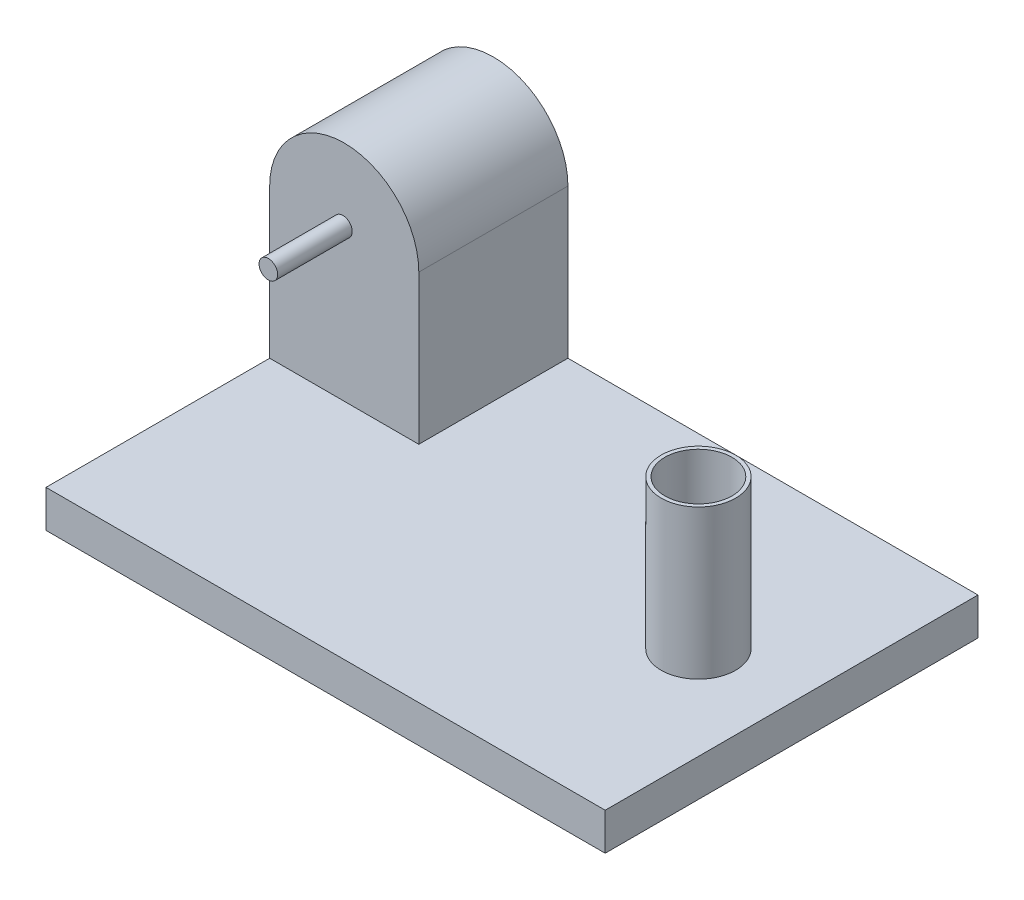
ISO-10303-21;
HEADER;
FILE_DESCRIPTION(('STEP AP214'),'2;1');
FILE_NAME('part.step','',(''),(''),'','','');
FILE_SCHEMA(('AUTOMOTIVE_DESIGN { 1 0 10303 214 1 1 1 1 }'));
ENDSEC;
DATA;
#1=APPLICATION_CONTEXT('core data for automotive mechanical design processes');
#2=APPLICATION_PROTOCOL_DEFINITION('international standard','automotive_design',2000,#1);
#3=PRODUCT_CONTEXT('',#1,'mechanical');
#4=PRODUCT('Part','Part','',(#3));
#5=PRODUCT_RELATED_PRODUCT_CATEGORY('part','',(#4));
#6=PRODUCT_DEFINITION_FORMATION('','',#4);
#7=PRODUCT_DEFINITION_CONTEXT('part definition',#1,'design');
#8=PRODUCT_DEFINITION('design','',#6,#7);
#9=PRODUCT_DEFINITION_SHAPE('','',#8);
#10=(LENGTH_UNIT() NAMED_UNIT(*) SI_UNIT(.MILLI.,.METRE.));
#11=(NAMED_UNIT(*) PLANE_ANGLE_UNIT() SI_UNIT($,.RADIAN.));
#12=(NAMED_UNIT(*) SI_UNIT($,.STERADIAN.) SOLID_ANGLE_UNIT());
#13=UNCERTAINTY_MEASURE_WITH_UNIT(LENGTH_MEASURE(1.E-05),#10,'distance_accuracy_value','');
#14=(GEOMETRIC_REPRESENTATION_CONTEXT(3) GLOBAL_UNCERTAINTY_ASSIGNED_CONTEXT((#13)) GLOBAL_UNIT_ASSIGNED_CONTEXT((#10,
#11,#12)) REPRESENTATION_CONTEXT('',''));
#15=CARTESIAN_POINT('',(0.,0.,0.));
#16=DIRECTION('',(0.,0.,1.));
#17=DIRECTION('',(1.,0.,0.));
#18=AXIS2_PLACEMENT_3D('',#15,#16,#17);
#19=CARTESIAN_POINT('',(-35.,70.,-10.));
#20=DIRECTION('',(-1.,0.,0.));
#21=DIRECTION('',(0.,0.,1.));
#22=AXIS2_PLACEMENT_3D('',#19,#20,#21);
#23=PLANE('',#22);
#24=DIRECTION('',(0.,0.,1.));
#25=VECTOR('',#24,1.);
#26=CARTESIAN_POINT('',(-35.,50.,-60.));
#27=LINE('',#26,#25);
#28=CARTESIAN_POINT('',(-35.,50.,-50.));
#29=VERTEX_POINT('',#28);
#30=CARTESIAN_POINT('',(-35.,50.,-10.));
#31=VERTEX_POINT('',#30);
#32=EDGE_CURVE('E98',#29,#31,#27,.T.);
#33=ORIENTED_EDGE('',*,*,#32,.T.);
#34=DIRECTION('',(0.,-1.,0.));
#35=VECTOR('',#34,1.);
#36=CARTESIAN_POINT('',(-35.,70.,-10.));
#37=LINE('',#36,#35);
#38=CARTESIAN_POINT('',(-35.,10.,-10.));
#39=VERTEX_POINT('',#38);
#40=EDGE_CURVE('E105',#31,#39,#37,.T.);
#41=ORIENTED_EDGE('',*,*,#40,.T.);
#42=DIRECTION('',(0.,0.,-1.));
#43=VECTOR('',#42,1.);
#44=CARTESIAN_POINT('',(-35.,10.,-10.));
#45=LINE('',#44,#43);
#46=CARTESIAN_POINT('',(-35.,10.,-50.));
#47=VERTEX_POINT('',#46);
#48=EDGE_CURVE('E113',#39,#47,#45,.T.);
#49=ORIENTED_EDGE('',*,*,#48,.T.);
#50=DIRECTION('',(0.,-1.,0.));
#51=VECTOR('',#50,1.);
#52=CARTESIAN_POINT('',(-35.,70.,-50.));
#53=LINE('',#52,#51);
#54=EDGE_CURVE('E58',#29,#47,#53,.T.);
#55=ORIENTED_EDGE('',*,*,#54,.F.);
#56=EDGE_LOOP('',(#33,#41,#49,#55));
#57=FACE_BOUND('',#56,.T.);
#58=ADVANCED_FACE('F35',(#57),#23,.F.);
#59=CARTESIAN_POINT('',(0.,10.,0.));
#60=DIRECTION('',(0.,-1.,0.));
#61=DIRECTION('',(0.,0.,-1.));
#62=AXIS2_PLACEMENT_3D('',#59,#60,#61);
#63=PLANE('',#62);
#64=CARTESIAN_POINT('',(50.,10.,0.));
#65=DIRECTION('',(0.,-1.,0.));
#66=DIRECTION('',(0.,0.,-1.));
#67=AXIS2_PLACEMENT_3D('',#64,#65,#66);
#68=CIRCLE('',#67,9.99999999999999);
#69=CARTESIAN_POINT('',(50.,10.,-9.99999999999999));
#70=VERTEX_POINT('',#69);
#71=EDGE_CURVE('E43',#70,#70,#68,.F.);
#72=ORIENTED_EDGE('',*,*,#71,.F.);
#73=EDGE_LOOP('',(#72));
#74=FACE_BOUND('',#73,.T.);
#75=ORIENTED_EDGE('',*,*,#48,.F.);
#76=DIRECTION('',(1.,0.,0.));
#77=VECTOR('',#76,1.);
#78=CARTESIAN_POINT('',(-75.,10.,-10.));
#79=LINE('',#78,#77);
#80=CARTESIAN_POINT('',(-75.,10.,-10.));
#81=VERTEX_POINT('',#80);
#82=EDGE_CURVE('E110',#81,#39,#79,.T.);
#83=ORIENTED_EDGE('',*,*,#82,.F.);
#84=DIRECTION('',(0.,0.,1.));
#85=VECTOR('',#84,1.);
#86=CARTESIAN_POINT('',(-75.,10.,50.));
#87=LINE('',#86,#85);
#88=CARTESIAN_POINT('',(-75.,10.,50.));
#89=VERTEX_POINT('',#88);
#90=EDGE_CURVE('E134',#81,#89,#87,.T.);
#91=ORIENTED_EDGE('',*,*,#90,.T.);
#92=DIRECTION('',(1.,0.,0.));
#93=VECTOR('',#92,1.);
#94=CARTESIAN_POINT('',(-75.,10.,50.));
#95=LINE('',#94,#93);
#96=CARTESIAN_POINT('',(75.,10.,50.));
#97=VERTEX_POINT('',#96);
#98=EDGE_CURVE('E136',#89,#97,#95,.T.);
#99=ORIENTED_EDGE('',*,*,#98,.T.);
#100=DIRECTION('',(0.,0.,-1.));
#101=VECTOR('',#100,1.);
#102=CARTESIAN_POINT('',(75.,10.,50.));
#103=LINE('',#102,#101);
#104=CARTESIAN_POINT('',(75.,10.,-50.));
#105=VERTEX_POINT('',#104);
#106=EDGE_CURVE('E128',#97,#105,#103,.T.);
#107=ORIENTED_EDGE('',*,*,#106,.T.);
#108=DIRECTION('',(-1.,0.,0.));
#109=VECTOR('',#108,1.);
#110=CARTESIAN_POINT('',(-75.,10.,-50.));
#111=LINE('',#110,#109);
#112=EDGE_CURVE('E131',#105,#47,#111,.T.);
#113=ORIENTED_EDGE('',*,*,#112,.T.);
#114=EDGE_LOOP('',(#75,#83,#91,#99,#107,#113));
#115=FACE_BOUND('',#114,.T.);
#116=ADVANCED_FACE('F161',(#74,#115),#63,.F.);
#117=CARTESIAN_POINT('',(75.,10.,50.));
#118=DIRECTION('',(-1.,0.,0.));
#119=DIRECTION('',(0.,0.,1.));
#120=AXIS2_PLACEMENT_3D('',#117,#118,#119);
#121=PLANE('',#120);
#122=DIRECTION('',(0.,0.,-1.));
#123=VECTOR('',#122,1.);
#124=CARTESIAN_POINT('',(75.,0.,50.));
#125=LINE('',#124,#123);
#126=CARTESIAN_POINT('',(75.,0.,50.));
#127=VERTEX_POINT('',#126);
#128=CARTESIAN_POINT('',(75.,0.,-50.));
#129=VERTEX_POINT('',#128);
#130=EDGE_CURVE('E127',#127,#129,#125,.T.);
#131=ORIENTED_EDGE('',*,*,#130,.T.);
#132=DIRECTION('',(0.,-1.,0.));
#133=VECTOR('',#132,1.);
#134=CARTESIAN_POINT('',(75.,10.,-50.));
#135=LINE('',#134,#133);
#136=EDGE_CURVE('E154',#105,#129,#135,.T.);
#137=ORIENTED_EDGE('',*,*,#136,.F.);
#138=ORIENTED_EDGE('',*,*,#106,.F.);
#139=DIRECTION('',(0.,-1.,0.));
#140=VECTOR('',#139,1.);
#141=CARTESIAN_POINT('',(75.,10.,50.));
#142=LINE('',#141,#140);
#143=EDGE_CURVE('E138',#97,#127,#142,.T.);
#144=ORIENTED_EDGE('',*,*,#143,.T.);
#145=EDGE_LOOP('',(#131,#137,#138,#144));
#146=FACE_BOUND('',#145,.T.);
#147=ADVANCED_FACE('F37',(#146),#121,.F.);
#148=CARTESIAN_POINT('',(-75.,10.,-50.));
#149=DIRECTION('',(0.,0.,1.));
#150=DIRECTION('',(1.,0.,0.));
#151=AXIS2_PLACEMENT_3D('',#148,#149,#150);
#152=PLANE('',#151);
#153=CARTESIAN_POINT('',(-55.,50.,-50.));
#154=DIRECTION('',(0.,0.,1.));
#155=DIRECTION('',(1.,0.,0.));
#156=AXIS2_PLACEMENT_3D('',#153,#154,#155);
#157=CIRCLE('',#156,20.);
#158=CARTESIAN_POINT('',(-75.,50.,-50.));
#159=VERTEX_POINT('',#158);
#160=EDGE_CURVE('E166',#159,#29,#157,.F.);
#161=ORIENTED_EDGE('',*,*,#160,.T.);
#162=ORIENTED_EDGE('',*,*,#54,.T.);
#163=ORIENTED_EDGE('',*,*,#112,.F.);
#164=ORIENTED_EDGE('',*,*,#136,.T.);
#165=DIRECTION('',(-1.,0.,0.));
#166=VECTOR('',#165,1.);
#167=CARTESIAN_POINT('',(-75.,0.,-50.));
#168=LINE('',#167,#166);
#169=CARTESIAN_POINT('',(-75.,0.,-50.));
#170=VERTEX_POINT('',#169);
#171=EDGE_CURVE('E141',#129,#170,#168,.T.);
#172=ORIENTED_EDGE('',*,*,#171,.T.);
#173=DIRECTION('',(0.,-1.,0.));
#174=VECTOR('',#173,1.);
#175=CARTESIAN_POINT('',(-75.,10.,-50.));
#176=LINE('',#175,#174);
#177=EDGE_CURVE('E152',#159,#170,#176,.T.);
#178=ORIENTED_EDGE('',*,*,#177,.F.);
#179=EDGE_LOOP('',(#161,#162,#163,#164,#172,#178));
#180=FACE_BOUND('',#179,.T.);
#181=ADVANCED_FACE('F217',(#180),#152,.F.);
#182=CARTESIAN_POINT('',(-75.,10.,50.));
#183=DIRECTION('',(1.,0.,0.));
#184=DIRECTION('',(0.,0.,-1.));
#185=AXIS2_PLACEMENT_3D('',#182,#183,#184);
#186=PLANE('',#185);
#187=DIRECTION('',(0.,-1.,0.));
#188=VECTOR('',#187,1.);
#189=CARTESIAN_POINT('',(-75.,70.,-10.));
#190=LINE('',#189,#188);
#191=CARTESIAN_POINT('',(-75.,50.,-10.));
#192=VERTEX_POINT('',#191);
#193=EDGE_CURVE('E50',#192,#81,#190,.T.);
#194=ORIENTED_EDGE('',*,*,#193,.F.);
#195=DIRECTION('',(0.,0.,1.));
#196=VECTOR('',#195,1.);
#197=CARTESIAN_POINT('',(-75.,50.,-60.));
#198=LINE('',#197,#196);
#199=EDGE_CURVE('E100',#159,#192,#198,.T.);
#200=ORIENTED_EDGE('',*,*,#199,.F.);
#201=ORIENTED_EDGE('',*,*,#177,.T.);
#202=DIRECTION('',(0.,0.,1.));
#203=VECTOR('',#202,1.);
#204=CARTESIAN_POINT('',(-75.,0.,50.));
#205=LINE('',#204,#203);
#206=CARTESIAN_POINT('',(-75.,0.,50.));
#207=VERTEX_POINT('',#206);
#208=EDGE_CURVE('E144',#170,#207,#205,.T.);
#209=ORIENTED_EDGE('',*,*,#208,.T.);
#210=DIRECTION('',(0.,-1.,0.));
#211=VECTOR('',#210,1.);
#212=CARTESIAN_POINT('',(-75.,10.,50.));
#213=LINE('',#212,#211);
#214=EDGE_CURVE('E149',#89,#207,#213,.T.);
#215=ORIENTED_EDGE('',*,*,#214,.F.);
#216=ORIENTED_EDGE('',*,*,#90,.F.);
#217=EDGE_LOOP('',(#194,#200,#201,#209,#215,#216));
#218=FACE_BOUND('',#217,.T.);
#219=ADVANCED_FACE('F214',(#218),#186,.F.);
#220=CARTESIAN_POINT('',(-75.,10.,50.));
#221=DIRECTION('',(0.,0.,-1.));
#222=DIRECTION('',(-1.,0.,0.));
#223=AXIS2_PLACEMENT_3D('',#220,#221,#222);
#224=PLANE('',#223);
#225=DIRECTION('',(1.,0.,0.));
#226=VECTOR('',#225,1.);
#227=CARTESIAN_POINT('',(-75.,0.,50.));
#228=LINE('',#227,#226);
#229=EDGE_CURVE('E132',#207,#127,#228,.T.);
#230=ORIENTED_EDGE('',*,*,#229,.T.);
#231=ORIENTED_EDGE('',*,*,#143,.F.);
#232=ORIENTED_EDGE('',*,*,#98,.F.);
#233=ORIENTED_EDGE('',*,*,#214,.T.);
#234=EDGE_LOOP('',(#230,#231,#232,#233));
#235=FACE_BOUND('',#234,.T.);
#236=ADVANCED_FACE('F210',(#235),#224,.F.);
#237=CARTESIAN_POINT('',(0.,0.,0.));
#238=DIRECTION('',(0.,-1.,0.));
#239=DIRECTION('',(0.,0.,-1.));
#240=AXIS2_PLACEMENT_3D('',#237,#238,#239);
#241=PLANE('',#240);
#242=ORIENTED_EDGE('',*,*,#130,.F.);
#243=ORIENTED_EDGE('',*,*,#229,.F.);
#244=ORIENTED_EDGE('',*,*,#208,.F.);
#245=ORIENTED_EDGE('',*,*,#171,.F.);
#246=EDGE_LOOP('',(#242,#243,#244,#245));
#247=FACE_BOUND('',#246,.T.);
#248=ADVANCED_FACE('F205',(#247),#241,.T.);
#249=CARTESIAN_POINT('',(50.,50.,0.));
#250=DIRECTION('',(0.,-1.,0.));
#251=DIRECTION('',(0.,0.,-1.));
#252=AXIS2_PLACEMENT_3D('',#249,#250,#251);
#253=CYLINDRICAL_SURFACE('',#252,9.99999999999999);
#254=CARTESIAN_POINT('',(50.,50.,0.));
#255=DIRECTION('',(0.,1.,0.));
#256=DIRECTION('',(0.,0.,1.));
#257=AXIS2_PLACEMENT_3D('',#254,#255,#256);
#258=CIRCLE('',#257,9.99999999999999);
#259=CARTESIAN_POINT('',(50.,50.,9.99999999999999));
#260=VERTEX_POINT('',#259);
#261=EDGE_CURVE('E122',#260,#260,#258,.T.);
#262=ORIENTED_EDGE('',*,*,#261,.F.);
#263=EDGE_LOOP('',(#262));
#264=FACE_BOUND('',#263,.T.);
#265=ORIENTED_EDGE('',*,*,#71,.T.);
#266=EDGE_LOOP('',(#265));
#267=FACE_BOUND('',#266,.T.);
#268=ADVANCED_FACE('F159',(#264,#267),#253,.T.);
#269=CARTESIAN_POINT('',(50.,50.,0.));
#270=DIRECTION('',(0.,1.,0.));
#271=DIRECTION('',(0.,0.,1.));
#272=AXIS2_PLACEMENT_3D('',#269,#270,#271);
#273=PLANE('',#272);
#274=CARTESIAN_POINT('',(50.,50.,0.));
#275=DIRECTION('',(0.,1.,0.));
#276=DIRECTION('',(0.,0.,1.));
#277=AXIS2_PLACEMENT_3D('',#274,#275,#276);
#278=CIRCLE('',#277,9.);
#279=CARTESIAN_POINT('',(50.,50.,9.));
#280=VERTEX_POINT('',#279);
#281=EDGE_CURVE('E118',#280,#280,#278,.T.);
#282=ORIENTED_EDGE('',*,*,#281,.F.);
#283=EDGE_LOOP('',(#282));
#284=FACE_BOUND('',#283,.T.);
#285=ORIENTED_EDGE('',*,*,#261,.T.);
#286=EDGE_LOOP('',(#285));
#287=FACE_BOUND('',#286,.T.);
#288=ADVANCED_FACE('F199',(#284,#287),#273,.T.);
#289=CARTESIAN_POINT('',(50.,10.,0.));
#290=DIRECTION('',(0.,1.,0.));
#291=DIRECTION('',(0.,0.,1.));
#292=AXIS2_PLACEMENT_3D('',#289,#290,#291);
#293=CYLINDRICAL_SURFACE('',#292,9.);
#294=CARTESIAN_POINT('',(50.,10.,0.));
#295=DIRECTION('',(0.,1.,0.));
#296=DIRECTION('',(0.,0.,1.));
#297=AXIS2_PLACEMENT_3D('',#294,#295,#296);
#298=CIRCLE('',#297,9.);
#299=CARTESIAN_POINT('',(50.,10.,9.));
#300=VERTEX_POINT('',#299);
#301=EDGE_CURVE('E119',#300,#300,#298,.T.);
#302=ORIENTED_EDGE('',*,*,#301,.F.);
#303=EDGE_LOOP('',(#302));
#304=FACE_BOUND('',#303,.T.);
#305=ORIENTED_EDGE('',*,*,#281,.T.);
#306=EDGE_LOOP('',(#305));
#307=FACE_BOUND('',#306,.T.);
#308=ADVANCED_FACE('F189',(#304,#307),#293,.F.);
#309=CARTESIAN_POINT('',(50.,10.,0.));
#310=DIRECTION('',(0.,1.,0.));
#311=DIRECTION('',(0.,0.,1.));
#312=AXIS2_PLACEMENT_3D('',#309,#310,#311);
#313=PLANE('',#312);
#314=ORIENTED_EDGE('',*,*,#301,.T.);
#315=EDGE_LOOP('',(#314));
#316=FACE_BOUND('',#315,.T.);
#317=ADVANCED_FACE('F182',(#316),#313,.T.);
#318=CARTESIAN_POINT('',(-75.,70.,-10.));
#319=DIRECTION('',(0.,0.,-1.));
#320=DIRECTION('',(-1.,0.,0.));
#321=AXIS2_PLACEMENT_3D('',#318,#319,#320);
#322=PLANE('',#321);
#323=CARTESIAN_POINT('',(-55.3532891017703,50.491778343094,-10.));
#324=DIRECTION('',(0.,0.,-1.));
#325=DIRECTION('',(-1.,0.,0.));
#326=AXIS2_PLACEMENT_3D('',#323,#324,#325);
#327=CIRCLE('',#326,2.5);
#328=CARTESIAN_POINT('',(-57.8532891017703,50.491778343094,-10.));
#329=VERTEX_POINT('',#328);
#330=EDGE_CURVE('E11',#329,#329,#327,.F.);
#331=ORIENTED_EDGE('',*,*,#330,.F.);
#332=EDGE_LOOP('',(#331));
#333=FACE_BOUND('',#332,.T.);
#334=ORIENTED_EDGE('',*,*,#40,.F.);
#335=CARTESIAN_POINT('',(-55.,50.,-10.));
#336=DIRECTION('',(0.,0.,-1.));
#337=DIRECTION('',(1.,0.,0.));
#338=AXIS2_PLACEMENT_3D('',#335,#336,#337);
#339=CIRCLE('',#338,20.);
#340=EDGE_CURVE('E95',#192,#31,#339,.T.);
#341=ORIENTED_EDGE('',*,*,#340,.F.);
#342=ORIENTED_EDGE('',*,*,#193,.T.);
#343=ORIENTED_EDGE('',*,*,#82,.T.);
#344=EDGE_LOOP('',(#334,#341,#342,#343));
#345=FACE_BOUND('',#344,.T.);
#346=ADVANCED_FACE('F109',(#333,#345),#322,.F.);
#347=CARTESIAN_POINT('',(-55.,50.,-60.));
#348=DIRECTION('',(0.,0.,1.));
#349=DIRECTION('',(1.,0.,0.));
#350=AXIS2_PLACEMENT_3D('',#347,#348,#349);
#351=CYLINDRICAL_SURFACE('',#350,20.);
#352=ORIENTED_EDGE('',*,*,#199,.T.);
#353=ORIENTED_EDGE('',*,*,#340,.T.);
#354=ORIENTED_EDGE('',*,*,#32,.F.);
#355=ORIENTED_EDGE('',*,*,#160,.F.);
#356=EDGE_LOOP('',(#352,#353,#354,#355));
#357=FACE_BOUND('',#356,.T.);
#358=ADVANCED_FACE('F97',(#357),#351,.T.);
#359=CARTESIAN_POINT('',(-55.3532891017703,50.491778343094,10.));
#360=DIRECTION('',(0.,0.,-1.));
#361=DIRECTION('',(-1.,0.,0.));
#362=AXIS2_PLACEMENT_3D('',#359,#360,#361);
#363=CYLINDRICAL_SURFACE('',#362,2.5);
#364=CARTESIAN_POINT('',(-55.3532891017703,50.491778343094,10.));
#365=DIRECTION('',(0.,0.,1.));
#366=DIRECTION('',(1.,0.,0.));
#367=AXIS2_PLACEMENT_3D('',#364,#365,#366);
#368=CIRCLE('',#367,2.5);
#369=CARTESIAN_POINT('',(-52.8532891017703,50.491778343094,10.));
#370=VERTEX_POINT('',#369);
#371=EDGE_CURVE('E107',#370,#370,#368,.T.);
#372=ORIENTED_EDGE('',*,*,#371,.F.);
#373=EDGE_LOOP('',(#372));
#374=FACE_BOUND('',#373,.T.);
#375=ORIENTED_EDGE('',*,*,#330,.T.);
#376=EDGE_LOOP('',(#375));
#377=FACE_BOUND('',#376,.T.);
#378=ADVANCED_FACE('F175',(#374,#377),#363,.T.);
#379=CARTESIAN_POINT('',(-55.3532891017703,50.491778343094,10.));
#380=DIRECTION('',(0.,0.,1.));
#381=DIRECTION('',(1.,0.,0.));
#382=AXIS2_PLACEMENT_3D('',#379,#380,#381);
#383=PLANE('',#382);
#384=ORIENTED_EDGE('',*,*,#371,.T.);
#385=EDGE_LOOP('',(#384));
#386=FACE_BOUND('',#385,.T.);
#387=ADVANCED_FACE('F173',(#386),#383,.T.);
#388=CLOSED_SHELL('',(#58,#116,#147,#181,#219,#236,#248,#268,#288,#308,#317,#346,#358,#378,#387));
#389=MANIFOLD_SOLID_BREP('B2',#388);
#390=ADVANCED_BREP_SHAPE_REPRESENTATION('',(#18,#389),#14);
#391=SHAPE_DEFINITION_REPRESENTATION(#9,#390);
ENDSEC;
END-ISO-10303-21;
